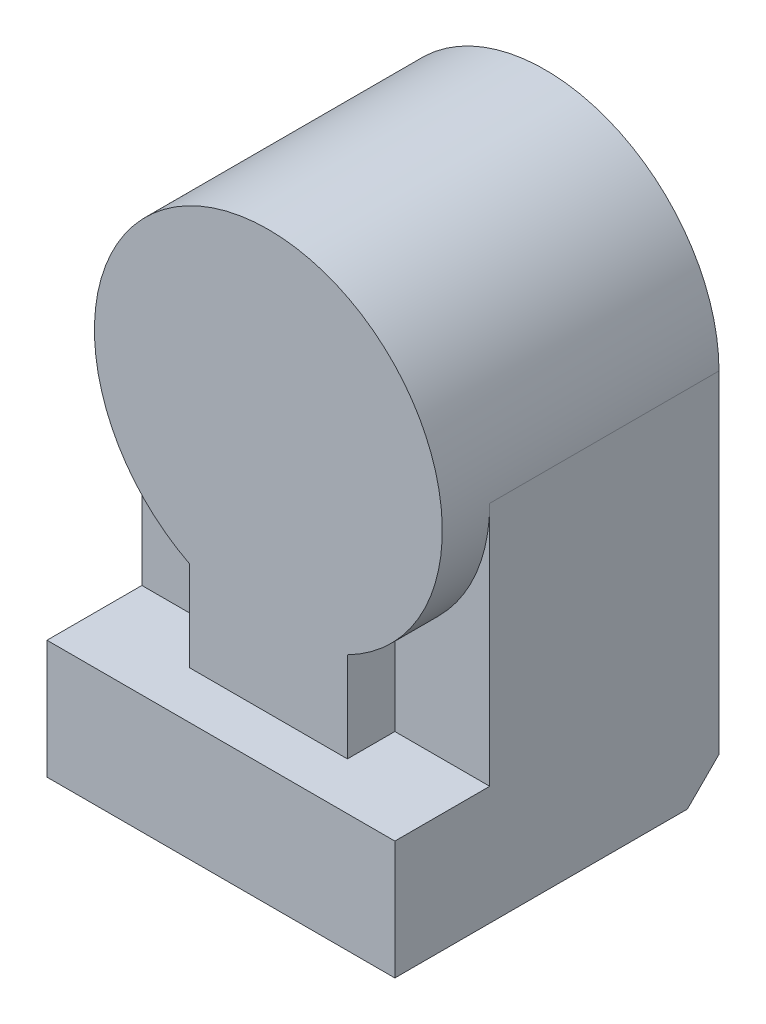
ISO-10303-21;
HEADER;
FILE_DESCRIPTION(('STEP AP214'),'2;1');
FILE_NAME('part.step','',(''),(''),'','','');
FILE_SCHEMA(('AUTOMOTIVE_DESIGN { 1 0 10303 214 1 1 1 1 }'));
ENDSEC;
DATA;
#1=APPLICATION_CONTEXT('core data for automotive mechanical design processes');
#2=APPLICATION_PROTOCOL_DEFINITION('international standard','automotive_design',2000,#1);
#3=PRODUCT_CONTEXT('',#1,'mechanical');
#4=PRODUCT('Part','Part','',(#3));
#5=PRODUCT_RELATED_PRODUCT_CATEGORY('part','',(#4));
#6=PRODUCT_DEFINITION_FORMATION('','',#4);
#7=PRODUCT_DEFINITION_CONTEXT('part definition',#1,'design');
#8=PRODUCT_DEFINITION('design','',#6,#7);
#9=PRODUCT_DEFINITION_SHAPE('','',#8);
#10=(LENGTH_UNIT() NAMED_UNIT(*) SI_UNIT(.MILLI.,.METRE.));
#11=(NAMED_UNIT(*) PLANE_ANGLE_UNIT() SI_UNIT($,.RADIAN.));
#12=(NAMED_UNIT(*) SI_UNIT($,.STERADIAN.) SOLID_ANGLE_UNIT());
#13=UNCERTAINTY_MEASURE_WITH_UNIT(LENGTH_MEASURE(1.E-05),#10,'distance_accuracy_value','');
#14=(GEOMETRIC_REPRESENTATION_CONTEXT(3) GLOBAL_UNCERTAINTY_ASSIGNED_CONTEXT((#13)) GLOBAL_UNIT_ASSIGNED_CONTEXT((#10,
#11,#12)) REPRESENTATION_CONTEXT('',''));
#15=CARTESIAN_POINT('',(0.,0.,0.));
#16=DIRECTION('',(0.,0.,1.));
#17=DIRECTION('',(1.,0.,0.));
#18=AXIS2_PLACEMENT_3D('',#15,#16,#17);
#19=CARTESIAN_POINT('',(0.,0.,14.5));
#20=DIRECTION('',(0.,0.,1.));
#21=DIRECTION('',(1.,0.,0.));
#22=AXIS2_PLACEMENT_3D('',#19,#20,#21);
#23=PLANE('',#22);
#24=DIRECTION('',(0.,-1.,0.));
#25=VECTOR('',#24,1.);
#26=CARTESIAN_POINT('',(-5.,-9.79795897113271,14.5));
#27=LINE('',#26,#25);
#28=CARTESIAN_POINT('',(-5.,-9.79795897113271,14.5));
#29=VERTEX_POINT('',#28);
#30=CARTESIAN_POINT('',(-5.,-15.5,14.5));
#31=VERTEX_POINT('',#30);
#32=EDGE_CURVE('E224',#29,#31,#27,.T.);
#33=ORIENTED_EDGE('',*,*,#32,.F.);
#34=CARTESIAN_POINT('',(0.,0.,14.5));
#35=DIRECTION('',(0.,0.,1.));
#36=DIRECTION('',(1.,0.,0.));
#37=AXIS2_PLACEMENT_3D('',#34,#35,#36);
#38=CIRCLE('',#37,11.);
#39=CARTESIAN_POINT('',(-11.,0.,14.5));
#40=VERTEX_POINT('',#39);
#41=EDGE_CURVE('E140',#40,#29,#38,.T.);
#42=ORIENTED_EDGE('',*,*,#41,.F.);
#43=DIRECTION('',(0.,-1.,0.));
#44=VECTOR('',#43,1.);
#45=CARTESIAN_POINT('',(-11.,0.,14.5));
#46=LINE('',#45,#44);
#47=CARTESIAN_POINT('',(-11.,-15.5,14.5));
#48=VERTEX_POINT('',#47);
#49=EDGE_CURVE('E187',#40,#48,#46,.T.);
#50=ORIENTED_EDGE('',*,*,#49,.T.);
#51=DIRECTION('',(-1.,0.,0.));
#52=VECTOR('',#51,1.);
#53=CARTESIAN_POINT('',(-11.,-15.5,14.5));
#54=LINE('',#53,#52);
#55=EDGE_CURVE('E36',#31,#48,#54,.T.);
#56=ORIENTED_EDGE('',*,*,#55,.F.);
#57=EDGE_LOOP('',(#33,#42,#50,#56));
#58=FACE_BOUND('',#57,.T.);
#59=ADVANCED_FACE('F32',(#58),#23,.T.);
#60=DIRECTION('',(0.,1.,0.));
#61=VECTOR('',#60,1.);
#62=CARTESIAN_POINT('',(11.,0.,14.5));
#63=LINE('',#62,#61);
#64=CARTESIAN_POINT('',(11.,-15.5,14.5));
#65=VERTEX_POINT('',#64);
#66=CARTESIAN_POINT('',(11.,0.,14.5));
#67=VERTEX_POINT('',#66);
#68=EDGE_CURVE('E164',#65,#67,#63,.T.);
#69=ORIENTED_EDGE('',*,*,#68,.T.);
#70=CARTESIAN_POINT('',(5.,-9.79795897113271,14.5));
#71=VERTEX_POINT('',#70);
#72=EDGE_CURVE('E211',#71,#67,#38,.T.);
#73=ORIENTED_EDGE('',*,*,#72,.F.);
#74=DIRECTION('',(0.,1.,0.));
#75=VECTOR('',#74,1.);
#76=CARTESIAN_POINT('',(5.,-15.5,14.5));
#77=LINE('',#76,#75);
#78=CARTESIAN_POINT('',(5.,-15.5,14.5));
#79=VERTEX_POINT('',#78);
#80=EDGE_CURVE('E135',#79,#71,#77,.T.);
#81=ORIENTED_EDGE('',*,*,#80,.F.);
#82=EDGE_CURVE('E58',#65,#79,#54,.T.);
#83=ORIENTED_EDGE('',*,*,#82,.F.);
#84=EDGE_LOOP('',(#69,#73,#81,#83));
#85=FACE_BOUND('',#84,.T.);
#86=ADVANCED_FACE('F210',(#85),#23,.T.);
#87=CARTESIAN_POINT('',(-11.,-15.5,20.5));
#88=DIRECTION('',(0.,-1.,0.));
#89=DIRECTION('',(0.,0.,-1.));
#90=AXIS2_PLACEMENT_3D('',#87,#88,#89);
#91=PLANE('',#90);
#92=DIRECTION('',(0.,0.,-1.));
#93=VECTOR('',#92,1.);
#94=CARTESIAN_POINT('',(-5.,-15.5,17.5));
#95=LINE('',#94,#93);
#96=CARTESIAN_POINT('',(-5.,-15.5,17.5));
#97=VERTEX_POINT('',#96);
#98=EDGE_CURVE('E50',#97,#31,#95,.T.);
#99=ORIENTED_EDGE('',*,*,#98,.T.);
#100=ORIENTED_EDGE('',*,*,#55,.T.);
#101=DIRECTION('',(0.,0.,-1.));
#102=VECTOR('',#101,1.);
#103=CARTESIAN_POINT('',(-11.,-15.5,20.5));
#104=LINE('',#103,#102);
#105=CARTESIAN_POINT('',(-11.,-15.5,20.5));
#106=VERTEX_POINT('',#105);
#107=EDGE_CURVE('E155',#106,#48,#104,.T.);
#108=ORIENTED_EDGE('',*,*,#107,.F.);
#109=DIRECTION('',(-1.,0.,0.));
#110=VECTOR('',#109,1.);
#111=CARTESIAN_POINT('',(-11.,-15.5,20.5));
#112=LINE('',#111,#110);
#113=CARTESIAN_POINT('',(11.,-15.5,20.5));
#114=VERTEX_POINT('',#113);
#115=EDGE_CURVE('E154',#114,#106,#112,.T.);
#116=ORIENTED_EDGE('',*,*,#115,.F.);
#117=DIRECTION('',(0.,0.,-1.));
#118=VECTOR('',#117,1.);
#119=CARTESIAN_POINT('',(11.,-15.5,20.5));
#120=LINE('',#119,#118);
#121=EDGE_CURVE('E168',#114,#65,#120,.T.);
#122=ORIENTED_EDGE('',*,*,#121,.T.);
#123=ORIENTED_EDGE('',*,*,#82,.T.);
#124=DIRECTION('',(0.,0.,-1.));
#125=VECTOR('',#124,1.);
#126=CARTESIAN_POINT('',(5.,-15.5,17.5));
#127=LINE('',#126,#125);
#128=CARTESIAN_POINT('',(5.,-15.5,17.5));
#129=VERTEX_POINT('',#128);
#130=EDGE_CURVE('E142',#129,#79,#127,.T.);
#131=ORIENTED_EDGE('',*,*,#130,.F.);
#132=DIRECTION('',(1.,0.,0.));
#133=VECTOR('',#132,1.);
#134=CARTESIAN_POINT('',(-5.,-15.5,17.5));
#135=LINE('',#134,#133);
#136=EDGE_CURVE('E125',#97,#129,#135,.T.);
#137=ORIENTED_EDGE('',*,*,#136,.F.);
#138=EDGE_LOOP('',(#99,#100,#108,#116,#122,#123,#131,#137));
#139=FACE_BOUND('',#138,.T.);
#140=ADVANCED_FACE('F223',(#139),#91,.F.);
#141=CARTESIAN_POINT('',(0.,0.,14.5));
#142=DIRECTION('',(0.,0.,-1.));
#143=DIRECTION('',(-1.,0.,0.));
#144=AXIS2_PLACEMENT_3D('',#141,#142,#143);
#145=CYLINDRICAL_SURFACE('',#144,11.);
#146=CARTESIAN_POINT('',(0.,0.,0.));
#147=DIRECTION('',(0.,0.,1.));
#148=DIRECTION('',(1.,0.,0.));
#149=AXIS2_PLACEMENT_3D('',#146,#147,#148);
#150=CIRCLE('',#149,11.);
#151=CARTESIAN_POINT('',(11.,0.,0.));
#152=VERTEX_POINT('',#151);
#153=CARTESIAN_POINT('',(-11.,0.,0.));
#154=VERTEX_POINT('',#153);
#155=EDGE_CURVE('E172',#152,#154,#150,.T.);
#156=ORIENTED_EDGE('',*,*,#155,.T.);
#157=DIRECTION('',(0.,0.,-1.));
#158=VECTOR('',#157,1.);
#159=CARTESIAN_POINT('',(-11.,0.,14.5));
#160=LINE('',#159,#158);
#161=EDGE_CURVE('E196',#40,#154,#160,.T.);
#162=ORIENTED_EDGE('',*,*,#161,.F.);
#163=ORIENTED_EDGE('',*,*,#41,.T.);
#164=DIRECTION('',(0.,0.,-1.));
#165=VECTOR('',#164,1.);
#166=CARTESIAN_POINT('',(-5.,-9.79795897113271,17.5));
#167=LINE('',#166,#165);
#168=CARTESIAN_POINT('',(-5.,-9.79795897113271,17.5));
#169=VERTEX_POINT('',#168);
#170=EDGE_CURVE('E121',#169,#29,#167,.T.);
#171=ORIENTED_EDGE('',*,*,#170,.F.);
#172=CARTESIAN_POINT('',(0.,0.,17.5));
#173=DIRECTION('',(0.,0.,1.));
#174=DIRECTION('',(1.,0.,0.));
#175=AXIS2_PLACEMENT_3D('',#172,#173,#174);
#176=CIRCLE('',#175,11.);
#177=CARTESIAN_POINT('',(5.,-9.79795897113271,17.5));
#178=VERTEX_POINT('',#177);
#179=EDGE_CURVE('E126',#178,#169,#176,.T.);
#180=ORIENTED_EDGE('',*,*,#179,.F.);
#181=DIRECTION('',(0.,0.,-1.));
#182=VECTOR('',#181,1.);
#183=CARTESIAN_POINT('',(5.,-9.79795897113271,17.5));
#184=LINE('',#183,#182);
#185=EDGE_CURVE('E230',#178,#71,#184,.T.);
#186=ORIENTED_EDGE('',*,*,#185,.T.);
#187=ORIENTED_EDGE('',*,*,#72,.T.);
#188=DIRECTION('',(0.,0.,-1.));
#189=VECTOR('',#188,1.);
#190=CARTESIAN_POINT('',(11.,0.,14.5));
#191=LINE('',#190,#189);
#192=EDGE_CURVE('E188',#67,#152,#191,.T.);
#193=ORIENTED_EDGE('',*,*,#192,.T.);
#194=EDGE_LOOP('',(#156,#162,#163,#171,#180,#186,#187,#193));
#195=FACE_BOUND('',#194,.T.);
#196=ADVANCED_FACE('F138',(#195),#145,.T.);
#197=CARTESIAN_POINT('',(-11.,0.,14.5));
#198=DIRECTION('',(1.,0.,0.));
#199=DIRECTION('',(0.,1.,0.));
#200=AXIS2_PLACEMENT_3D('',#197,#198,#199);
#201=PLANE('',#200);
#202=DIRECTION('',(0.,-1.,0.));
#203=VECTOR('',#202,1.);
#204=CARTESIAN_POINT('',(-11.,0.,0.));
#205=LINE('',#204,#203);
#206=CARTESIAN_POINT('',(-11.,-21.,0.));
#207=VERTEX_POINT('',#206);
#208=EDGE_CURVE('E177',#154,#207,#205,.T.);
#209=ORIENTED_EDGE('',*,*,#208,.T.);
#210=DIRECTION('',(0.,0.707106781186548,-0.707106781186547));
#211=VECTOR('',#210,1.);
#212=CARTESIAN_POINT('',(-11.,-23.,2.00000000000001));
#213=LINE('',#212,#211);
#214=CARTESIAN_POINT('',(-11.,-23.,2.00000000000001));
#215=VERTEX_POINT('',#214);
#216=EDGE_CURVE('E11',#207,#215,#213,.F.);
#217=ORIENTED_EDGE('',*,*,#216,.T.);
#218=DIRECTION('',(0.,0.,-1.));
#219=VECTOR('',#218,1.);
#220=CARTESIAN_POINT('',(-11.,-23.,14.5));
#221=LINE('',#220,#219);
#222=CARTESIAN_POINT('',(-11.,-23.,20.5));
#223=VERTEX_POINT('',#222);
#224=EDGE_CURVE('E193',#223,#215,#221,.T.);
#225=ORIENTED_EDGE('',*,*,#224,.F.);
#226=DIRECTION('',(0.,-1.,0.));
#227=VECTOR('',#226,1.);
#228=CARTESIAN_POINT('',(-11.,-23.,20.5));
#229=LINE('',#228,#227);
#230=EDGE_CURVE('E146',#106,#223,#229,.T.);
#231=ORIENTED_EDGE('',*,*,#230,.F.);
#232=ORIENTED_EDGE('',*,*,#107,.T.);
#233=ORIENTED_EDGE('',*,*,#49,.F.);
#234=ORIENTED_EDGE('',*,*,#161,.T.);
#235=EDGE_LOOP('',(#209,#217,#225,#231,#232,#233,#234));
#236=FACE_BOUND('',#235,.T.);
#237=ADVANCED_FACE('F220',(#236),#201,.F.);
#238=CARTESIAN_POINT('',(-11.,-23.,14.5));
#239=DIRECTION('',(0.,1.,0.));
#240=DIRECTION('',(0.,0.,1.));
#241=AXIS2_PLACEMENT_3D('',#238,#239,#240);
#242=PLANE('',#241);
#243=ORIENTED_EDGE('',*,*,#224,.T.);
#244=DIRECTION('',(1.,0.,0.));
#245=VECTOR('',#244,1.);
#246=CARTESIAN_POINT('',(-11.,-23.,2.00000000000001));
#247=LINE('',#246,#245);
#248=CARTESIAN_POINT('',(11.,-23.,2.));
#249=VERTEX_POINT('',#248);
#250=EDGE_CURVE('E199',#215,#249,#247,.T.);
#251=ORIENTED_EDGE('',*,*,#250,.T.);
#252=DIRECTION('',(0.,0.,-1.));
#253=VECTOR('',#252,1.);
#254=CARTESIAN_POINT('',(11.,-23.,14.5));
#255=LINE('',#254,#253);
#256=CARTESIAN_POINT('',(11.,-23.,20.5));
#257=VERTEX_POINT('',#256);
#258=EDGE_CURVE('E190',#257,#249,#255,.T.);
#259=ORIENTED_EDGE('',*,*,#258,.F.);
#260=DIRECTION('',(1.,0.,0.));
#261=VECTOR('',#260,1.);
#262=CARTESIAN_POINT('',(-11.,-23.,20.5));
#263=LINE('',#262,#261);
#264=EDGE_CURVE('E149',#223,#257,#263,.T.);
#265=ORIENTED_EDGE('',*,*,#264,.F.);
#266=EDGE_LOOP('',(#243,#251,#259,#265));
#267=FACE_BOUND('',#266,.T.);
#268=ADVANCED_FACE('F256',(#267),#242,.F.);
#269=CARTESIAN_POINT('',(11.,0.,14.5));
#270=DIRECTION('',(-1.,0.,0.));
#271=DIRECTION('',(0.,-1.,0.));
#272=AXIS2_PLACEMENT_3D('',#269,#270,#271);
#273=PLANE('',#272);
#274=ORIENTED_EDGE('',*,*,#258,.T.);
#275=DIRECTION('',(0.,-0.707106781186548,0.707106781186547));
#276=VECTOR('',#275,1.);
#277=CARTESIAN_POINT('',(11.,-23.,2.));
#278=LINE('',#277,#276);
#279=CARTESIAN_POINT('',(11.,-21.,0.));
#280=VERTEX_POINT('',#279);
#281=EDGE_CURVE('E202',#249,#280,#278,.F.);
#282=ORIENTED_EDGE('',*,*,#281,.T.);
#283=DIRECTION('',(0.,1.,0.));
#284=VECTOR('',#283,1.);
#285=CARTESIAN_POINT('',(11.,0.,0.));
#286=LINE('',#285,#284);
#287=EDGE_CURVE('E182',#280,#152,#286,.T.);
#288=ORIENTED_EDGE('',*,*,#287,.T.);
#289=ORIENTED_EDGE('',*,*,#192,.F.);
#290=ORIENTED_EDGE('',*,*,#68,.F.);
#291=ORIENTED_EDGE('',*,*,#121,.F.);
#292=DIRECTION('',(0.,1.,0.));
#293=VECTOR('',#292,1.);
#294=CARTESIAN_POINT('',(11.,-23.,20.5));
#295=LINE('',#294,#293);
#296=EDGE_CURVE('E152',#257,#114,#295,.T.);
#297=ORIENTED_EDGE('',*,*,#296,.F.);
#298=EDGE_LOOP('',(#274,#282,#288,#289,#290,#291,#297));
#299=FACE_BOUND('',#298,.T.);
#300=ADVANCED_FACE('F213',(#299),#273,.F.);
#301=CARTESIAN_POINT('',(0.,0.,0.));
#302=DIRECTION('',(0.,0.,1.));
#303=DIRECTION('',(1.,0.,0.));
#304=AXIS2_PLACEMENT_3D('',#301,#302,#303);
#305=PLANE('',#304);
#306=ORIENTED_EDGE('',*,*,#287,.F.);
#307=DIRECTION('',(-1.,0.,0.));
#308=VECTOR('',#307,1.);
#309=CARTESIAN_POINT('',(0.,-21.,0.));
#310=LINE('',#309,#308);
#311=EDGE_CURVE('E42',#280,#207,#310,.T.);
#312=ORIENTED_EDGE('',*,*,#311,.T.);
#313=ORIENTED_EDGE('',*,*,#208,.F.);
#314=ORIENTED_EDGE('',*,*,#155,.F.);
#315=EDGE_LOOP('',(#306,#312,#313,#314));
#316=FACE_BOUND('',#315,.T.);
#317=ADVANCED_FACE('F216',(#316),#305,.F.);
#318=CARTESIAN_POINT('',(-11.,-23.,2.00000000000001));
#319=DIRECTION('',(0.,0.707106781186547,0.707106781186548));
#320=DIRECTION('',(1.,0.,0.));
#321=AXIS2_PLACEMENT_3D('',#318,#319,#320);
#322=PLANE('',#321);
#323=ORIENTED_EDGE('',*,*,#216,.F.);
#324=ORIENTED_EDGE('',*,*,#311,.F.);
#325=ORIENTED_EDGE('',*,*,#281,.F.);
#326=ORIENTED_EDGE('',*,*,#250,.F.);
#327=EDGE_LOOP('',(#323,#324,#325,#326));
#328=FACE_BOUND('',#327,.T.);
#329=ADVANCED_FACE('F34',(#328),#322,.F.);
#330=CARTESIAN_POINT('',(0.,0.,20.5));
#331=DIRECTION('',(0.,0.,-1.));
#332=DIRECTION('',(-1.,0.,0.));
#333=AXIS2_PLACEMENT_3D('',#330,#331,#332);
#334=PLANE('',#333);
#335=ORIENTED_EDGE('',*,*,#230,.T.);
#336=ORIENTED_EDGE('',*,*,#264,.T.);
#337=ORIENTED_EDGE('',*,*,#296,.T.);
#338=ORIENTED_EDGE('',*,*,#115,.T.);
#339=EDGE_LOOP('',(#335,#336,#337,#338));
#340=FACE_BOUND('',#339,.T.);
#341=ADVANCED_FACE('F242',(#340),#334,.F.);
#342=CARTESIAN_POINT('',(-5.,-9.79795897113271,17.5));
#343=DIRECTION('',(1.,0.,0.));
#344=DIRECTION('',(0.,0.,-1.));
#345=AXIS2_PLACEMENT_3D('',#342,#343,#344);
#346=PLANE('',#345);
#347=ORIENTED_EDGE('',*,*,#32,.T.);
#348=ORIENTED_EDGE('',*,*,#98,.F.);
#349=DIRECTION('',(0.,-1.,0.));
#350=VECTOR('',#349,1.);
#351=CARTESIAN_POINT('',(-5.,-9.79795897113271,17.5));
#352=LINE('',#351,#350);
#353=EDGE_CURVE('E117',#169,#97,#352,.T.);
#354=ORIENTED_EDGE('',*,*,#353,.F.);
#355=ORIENTED_EDGE('',*,*,#170,.T.);
#356=EDGE_LOOP('',(#347,#348,#354,#355));
#357=FACE_BOUND('',#356,.T.);
#358=ADVANCED_FACE('F119',(#357),#346,.F.);
#359=CARTESIAN_POINT('',(5.,-15.5,17.5));
#360=DIRECTION('',(-1.,0.,0.));
#361=DIRECTION('',(0.,0.,1.));
#362=AXIS2_PLACEMENT_3D('',#359,#360,#361);
#363=PLANE('',#362);
#364=ORIENTED_EDGE('',*,*,#80,.T.);
#365=ORIENTED_EDGE('',*,*,#185,.F.);
#366=DIRECTION('',(0.,1.,0.));
#367=VECTOR('',#366,1.);
#368=CARTESIAN_POINT('',(5.,-15.5,17.5));
#369=LINE('',#368,#367);
#370=EDGE_CURVE('E131',#129,#178,#369,.T.);
#371=ORIENTED_EDGE('',*,*,#370,.F.);
#372=ORIENTED_EDGE('',*,*,#130,.T.);
#373=EDGE_LOOP('',(#364,#365,#371,#372));
#374=FACE_BOUND('',#373,.T.);
#375=ADVANCED_FACE('F233',(#374),#363,.F.);
#376=CARTESIAN_POINT('',(0.,0.,17.5));
#377=DIRECTION('',(0.,0.,1.));
#378=DIRECTION('',(1.,0.,0.));
#379=AXIS2_PLACEMENT_3D('',#376,#377,#378);
#380=PLANE('',#379);
#381=ORIENTED_EDGE('',*,*,#179,.T.);
#382=ORIENTED_EDGE('',*,*,#353,.T.);
#383=ORIENTED_EDGE('',*,*,#136,.T.);
#384=ORIENTED_EDGE('',*,*,#370,.T.);
#385=EDGE_LOOP('',(#381,#382,#383,#384));
#386=FACE_BOUND('',#385,.T.);
#387=ADVANCED_FACE('F129',(#386),#380,.T.);
#388=CLOSED_SHELL('',(#59,#86,#140,#196,#237,#268,#300,#317,#329,#341,#358,#375,#387));
#389=MANIFOLD_SOLID_BREP('B2',#388);
#390=ADVANCED_BREP_SHAPE_REPRESENTATION('',(#18,#389),#14);
#391=SHAPE_DEFINITION_REPRESENTATION(#9,#390);
ENDSEC;
END-ISO-10303-21;
